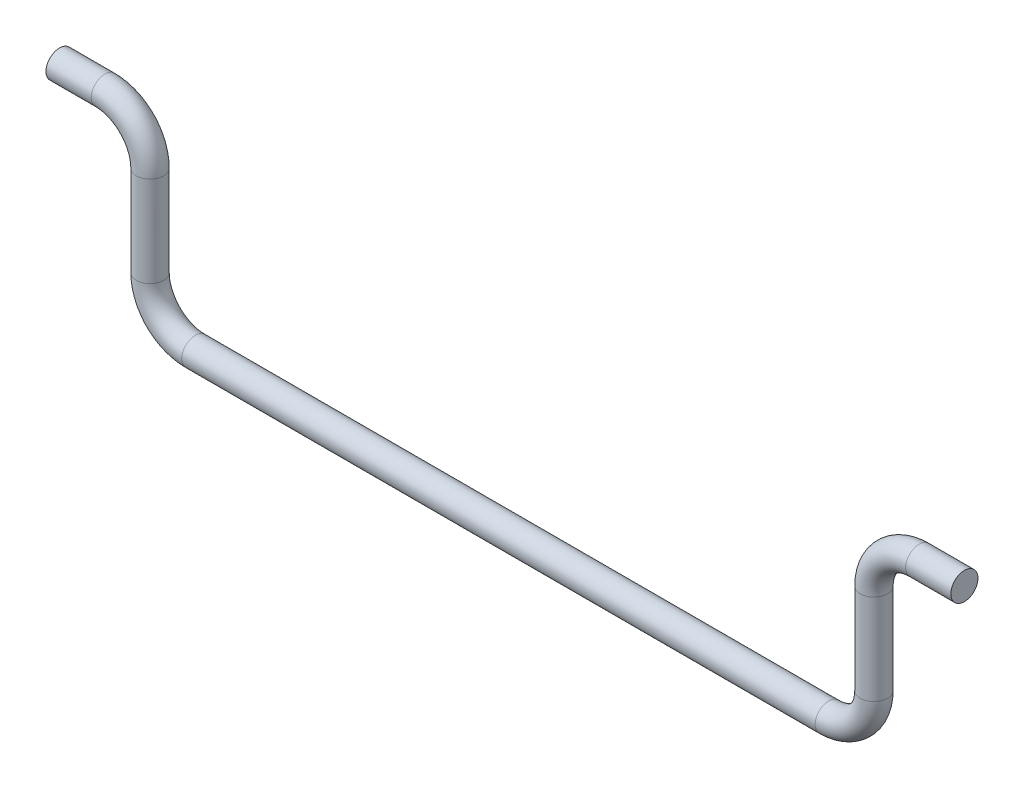
ISO-10303-21;
HEADER;
FILE_DESCRIPTION(('STEP AP214'),'2;1');
FILE_NAME('part.step','',(''),(''),'','','');
FILE_SCHEMA(('AUTOMOTIVE_DESIGN { 1 0 10303 214 1 1 1 1 }'));
ENDSEC;
DATA;
#1=APPLICATION_CONTEXT('core data for automotive mechanical design processes');
#2=APPLICATION_PROTOCOL_DEFINITION('international standard','automotive_design',2000,#1);
#3=PRODUCT_CONTEXT('',#1,'mechanical');
#4=PRODUCT('Part','Part','',(#3));
#5=PRODUCT_RELATED_PRODUCT_CATEGORY('part','',(#4));
#6=PRODUCT_DEFINITION_FORMATION('','',#4);
#7=PRODUCT_DEFINITION_CONTEXT('part definition',#1,'design');
#8=PRODUCT_DEFINITION('design','',#6,#7);
#9=PRODUCT_DEFINITION_SHAPE('','',#8);
#10=(LENGTH_UNIT() NAMED_UNIT(*) SI_UNIT(.MILLI.,.METRE.));
#11=(NAMED_UNIT(*) PLANE_ANGLE_UNIT() SI_UNIT($,.RADIAN.));
#12=(NAMED_UNIT(*) SI_UNIT($,.STERADIAN.) SOLID_ANGLE_UNIT());
#13=UNCERTAINTY_MEASURE_WITH_UNIT(LENGTH_MEASURE(1.E-05),#10,'distance_accuracy_value','');
#14=(GEOMETRIC_REPRESENTATION_CONTEXT(3) GLOBAL_UNCERTAINTY_ASSIGNED_CONTEXT((#13)) GLOBAL_UNIT_ASSIGNED_CONTEXT((#10,
#11,#12)) REPRESENTATION_CONTEXT('',''));
#15=CARTESIAN_POINT('',(0.,0.,0.));
#16=DIRECTION('',(0.,0.,1.));
#17=DIRECTION('',(1.,0.,0.));
#18=AXIS2_PLACEMENT_3D('',#15,#16,#17);
#19=CARTESIAN_POINT('',(0.,0.,0.));
#20=DIRECTION('',(1.,0.,0.));
#21=DIRECTION('',(0.,0.,-1.));
#22=AXIS2_PLACEMENT_3D('',#19,#20,#21);
#23=PLANE('',#22);
#24=CARTESIAN_POINT('',(0.,0.,0.));
#25=DIRECTION('',(1.,0.,0.));
#26=DIRECTION('',(0.,0.,-1.));
#27=AXIS2_PLACEMENT_3D('',#24,#25,#26);
#28=CIRCLE('',#27,0.6);
#29=CARTESIAN_POINT('',(0.,0.,-0.6));
#30=VERTEX_POINT('',#29);
#31=EDGE_CURVE('E65',#30,#30,#28,.T.);
#32=ORIENTED_EDGE('',*,*,#31,.F.);
#33=EDGE_LOOP('',(#32));
#34=FACE_BOUND('',#33,.T.);
#35=ADVANCED_FACE('F31',(#34),#23,.F.);
#36=CARTESIAN_POINT('',(40.,0.,0.));
#37=DIRECTION('',(1.,0.,0.));
#38=DIRECTION('',(0.,0.,-1.));
#39=AXIS2_PLACEMENT_3D('',#36,#37,#38);
#40=PLANE('',#39);
#41=CARTESIAN_POINT('',(40.,0.,0.));
#42=DIRECTION('',(1.,0.,0.));
#43=DIRECTION('',(0.,0.,-1.));
#44=AXIS2_PLACEMENT_3D('',#41,#42,#43);
#45=CIRCLE('',#44,0.6);
#46=CARTESIAN_POINT('',(40.,0.,-0.6));
#47=VERTEX_POINT('',#46);
#48=EDGE_CURVE('E10',#47,#47,#45,.T.);
#49=ORIENTED_EDGE('',*,*,#48,.T.);
#50=EDGE_LOOP('',(#49));
#51=FACE_BOUND('',#50,.T.);
#52=ADVANCED_FACE('F72',(#51),#40,.T.);
#53=CARTESIAN_POINT('',(0.,0.,0.));
#54=DIRECTION('',(1.,0.,0.));
#55=DIRECTION('',(0.,0.,-1.));
#56=AXIS2_PLACEMENT_3D('',#53,#54,#55);
#57=CYLINDRICAL_SURFACE('',#56,0.6);
#58=CARTESIAN_POINT('',(1.99999999999999,0.,0.));
#59=DIRECTION('',(1.,0.,0.));
#60=DIRECTION('',(0.,0.,-1.));
#61=AXIS2_PLACEMENT_3D('',#58,#59,#60);
#62=CIRCLE('',#61,0.6);
#63=CARTESIAN_POINT('',(1.99999999999998,0.6,0.));
#64=VERTEX_POINT('',#63);
#65=EDGE_CURVE('E62',#64,#64,#62,.T.);
#66=ORIENTED_EDGE('',*,*,#65,.F.);
#67=EDGE_LOOP('',(#66));
#68=FACE_BOUND('',#67,.T.);
#69=ORIENTED_EDGE('',*,*,#31,.T.);
#70=EDGE_LOOP('',(#69));
#71=FACE_BOUND('',#70,.T.);
#72=ADVANCED_FACE('F69',(#68,#71),#57,.T.);
#73=CARTESIAN_POINT('',(2.,-2.,0.));
#74=DIRECTION('',(0.,0.,-1.));
#75=DIRECTION('',(-1.,0.,0.));
#76=AXIS2_PLACEMENT_3D('',#73,#74,#75);
#77=TOROIDAL_SURFACE('',#76,2.,0.6);
#78=CARTESIAN_POINT('',(4.,-2.00000000000001,0.));
#79=DIRECTION('',(0.,-1.,0.));
#80=DIRECTION('',(0.,0.,-1.));
#81=AXIS2_PLACEMENT_3D('',#78,#79,#80);
#82=CIRCLE('',#81,0.6);
#83=CARTESIAN_POINT('',(4.6,-2.00000000000002,0.));
#84=VERTEX_POINT('',#83);
#85=EDGE_CURVE('E59',#84,#84,#82,.T.);
#86=CARTESIAN_POINT('',(2.,-2.,0.));
#87=DIRECTION('',(0.,0.,-1.));
#88=DIRECTION('',(-1.,0.,0.));
#89=AXIS2_PLACEMENT_3D('',#86,#87,#88);
#90=CIRCLE('',#89,2.6);
#91=EDGE_CURVE('',#64,#84,#90,.T.);
#92=ORIENTED_EDGE('',*,*,#65,.T.);
#93=ORIENTED_EDGE('',*,*,#85,.F.);
#94=ORIENTED_EDGE('',*,*,#91,.T.);
#95=ORIENTED_EDGE('',*,*,#91,.F.);
#96=EDGE_LOOP('',(#92,#94,#93,#95));
#97=FACE_BOUND('',#96,.T.);
#98=ADVANCED_FACE('F106',(#97),#77,.T.);
#99=CARTESIAN_POINT('',(4.,-2.00000000000001,0.));
#100=DIRECTION('',(0.,-1.,0.));
#101=DIRECTION('',(0.,0.,-1.));
#102=AXIS2_PLACEMENT_3D('',#99,#100,#101);
#103=CYLINDRICAL_SURFACE('',#102,0.6);
#104=CARTESIAN_POINT('',(4.,-5.99999999999999,0.));
#105=DIRECTION('',(0.,-1.,0.));
#106=DIRECTION('',(0.,0.,-1.));
#107=AXIS2_PLACEMENT_3D('',#104,#105,#106);
#108=CIRCLE('',#107,0.6);
#109=CARTESIAN_POINT('',(3.4,-5.99999999999998,0.));
#110=VERTEX_POINT('',#109);
#111=EDGE_CURVE('E56',#110,#110,#108,.T.);
#112=ORIENTED_EDGE('',*,*,#111,.F.);
#113=EDGE_LOOP('',(#112));
#114=FACE_BOUND('',#113,.T.);
#115=ORIENTED_EDGE('',*,*,#85,.T.);
#116=EDGE_LOOP('',(#115));
#117=FACE_BOUND('',#116,.T.);
#118=ADVANCED_FACE('F102',(#114,#117),#103,.T.);
#119=CARTESIAN_POINT('',(6.,-6.,0.));
#120=DIRECTION('',(0.,0.,1.));
#121=DIRECTION('',(1.,0.,0.));
#122=AXIS2_PLACEMENT_3D('',#119,#120,#121);
#123=TOROIDAL_SURFACE('',#122,2.,0.6);
#124=CARTESIAN_POINT('',(6.00000000000001,-8.,0.));
#125=DIRECTION('',(1.,0.,0.));
#126=DIRECTION('',(0.,0.,-1.));
#127=AXIS2_PLACEMENT_3D('',#124,#125,#126);
#128=CIRCLE('',#127,0.6);
#129=CARTESIAN_POINT('',(6.00000000000002,-8.6,0.));
#130=VERTEX_POINT('',#129);
#131=EDGE_CURVE('E53',#130,#130,#128,.T.);
#132=CARTESIAN_POINT('',(6.,-6.,0.));
#133=DIRECTION('',(0.,0.,1.));
#134=DIRECTION('',(1.,0.,0.));
#135=AXIS2_PLACEMENT_3D('',#132,#133,#134);
#136=CIRCLE('',#135,2.6);
#137=EDGE_CURVE('',#110,#130,#136,.T.);
#138=ORIENTED_EDGE('',*,*,#111,.T.);
#139=ORIENTED_EDGE('',*,*,#131,.F.);
#140=ORIENTED_EDGE('',*,*,#137,.T.);
#141=ORIENTED_EDGE('',*,*,#137,.F.);
#142=EDGE_LOOP('',(#138,#140,#139,#141));
#143=FACE_BOUND('',#142,.T.);
#144=ADVANCED_FACE('F98',(#143),#123,.T.);
#145=CARTESIAN_POINT('',(6.00000000000001,-8.,0.));
#146=DIRECTION('',(1.,0.,0.));
#147=DIRECTION('',(0.,1.,0.));
#148=AXIS2_PLACEMENT_3D('',#145,#146,#147);
#149=CYLINDRICAL_SURFACE('',#148,0.6);
#150=CARTESIAN_POINT('',(34.,-8.,0.));
#151=DIRECTION('',(1.,0.,0.));
#152=DIRECTION('',(0.,0.,-1.));
#153=AXIS2_PLACEMENT_3D('',#150,#151,#152);
#154=CIRCLE('',#153,0.6);
#155=CARTESIAN_POINT('',(34.,-8.6,0.));
#156=VERTEX_POINT('',#155);
#157=EDGE_CURVE('E50',#156,#156,#154,.T.);
#158=ORIENTED_EDGE('',*,*,#157,.F.);
#159=EDGE_LOOP('',(#158));
#160=FACE_BOUND('',#159,.T.);
#161=ORIENTED_EDGE('',*,*,#131,.T.);
#162=EDGE_LOOP('',(#161));
#163=FACE_BOUND('',#162,.T.);
#164=ADVANCED_FACE('F94',(#160,#163),#149,.T.);
#165=CARTESIAN_POINT('',(34.,-6.,0.));
#166=DIRECTION('',(0.,0.,1.));
#167=DIRECTION('',(1.,0.,0.));
#168=AXIS2_PLACEMENT_3D('',#165,#166,#167);
#169=TOROIDAL_SURFACE('',#168,2.,0.6);
#170=CARTESIAN_POINT('',(36.,-6.,0.));
#171=DIRECTION('',(0.,1.,0.));
#172=DIRECTION('',(0.,0.,-1.));
#173=AXIS2_PLACEMENT_3D('',#170,#171,#172);
#174=CIRCLE('',#173,0.6);
#175=CARTESIAN_POINT('',(36.6,-6.,0.));
#176=VERTEX_POINT('',#175);
#177=EDGE_CURVE('E45',#176,#176,#174,.T.);
#178=CARTESIAN_POINT('',(34.,-6.,0.));
#179=DIRECTION('',(0.,0.,1.));
#180=DIRECTION('',(1.,0.,0.));
#181=AXIS2_PLACEMENT_3D('',#178,#179,#180);
#182=CIRCLE('',#181,2.6);
#183=EDGE_CURVE('',#156,#176,#182,.T.);
#184=ORIENTED_EDGE('',*,*,#157,.T.);
#185=ORIENTED_EDGE('',*,*,#177,.F.);
#186=ORIENTED_EDGE('',*,*,#183,.T.);
#187=ORIENTED_EDGE('',*,*,#183,.F.);
#188=EDGE_LOOP('',(#184,#186,#185,#187));
#189=FACE_BOUND('',#188,.T.);
#190=ADVANCED_FACE('F90',(#189),#169,.T.);
#191=CARTESIAN_POINT('',(36.,-6.,0.));
#192=DIRECTION('',(0.,1.,0.));
#193=DIRECTION('',(0.,0.,1.));
#194=AXIS2_PLACEMENT_3D('',#191,#192,#193);
#195=CYLINDRICAL_SURFACE('',#194,0.6);
#196=CARTESIAN_POINT('',(36.,-2.00000000000001,0.));
#197=DIRECTION('',(0.,1.,0.));
#198=DIRECTION('',(0.,0.,-1.));
#199=AXIS2_PLACEMENT_3D('',#196,#197,#198);
#200=CIRCLE('',#199,0.6);
#201=CARTESIAN_POINT('',(35.4,-2.00000000000002,0.));
#202=VERTEX_POINT('',#201);
#203=EDGE_CURVE('E41',#202,#202,#200,.T.);
#204=ORIENTED_EDGE('',*,*,#203,.F.);
#205=EDGE_LOOP('',(#204));
#206=FACE_BOUND('',#205,.T.);
#207=ORIENTED_EDGE('',*,*,#177,.T.);
#208=EDGE_LOOP('',(#207));
#209=FACE_BOUND('',#208,.T.);
#210=ADVANCED_FACE('F84',(#206,#209),#195,.T.);
#211=CARTESIAN_POINT('',(38.,-2.,0.));
#212=DIRECTION('',(0.,0.,-1.));
#213=DIRECTION('',(-1.,0.,0.));
#214=AXIS2_PLACEMENT_3D('',#211,#212,#213);
#215=TOROIDAL_SURFACE('',#214,2.,0.6);
#216=CARTESIAN_POINT('',(38.,0.,0.));
#217=DIRECTION('',(1.,0.,0.));
#218=DIRECTION('',(0.,0.,-1.));
#219=AXIS2_PLACEMENT_3D('',#216,#217,#218);
#220=CIRCLE('',#219,0.6);
#221=CARTESIAN_POINT('',(38.,0.600000000000002,0.));
#222=VERTEX_POINT('',#221);
#223=EDGE_CURVE('E37',#222,#222,#220,.T.);
#224=CARTESIAN_POINT('',(38.,-2.,0.));
#225=DIRECTION('',(0.,0.,-1.));
#226=DIRECTION('',(-1.,0.,0.));
#227=AXIS2_PLACEMENT_3D('',#224,#225,#226);
#228=CIRCLE('',#227,2.6);
#229=EDGE_CURVE('',#202,#222,#228,.T.);
#230=ORIENTED_EDGE('',*,*,#203,.T.);
#231=ORIENTED_EDGE('',*,*,#223,.F.);
#232=ORIENTED_EDGE('',*,*,#229,.T.);
#233=ORIENTED_EDGE('',*,*,#229,.F.);
#234=EDGE_LOOP('',(#230,#232,#231,#233));
#235=FACE_BOUND('',#234,.T.);
#236=ADVANCED_FACE('F78',(#235),#215,.T.);
#237=CARTESIAN_POINT('',(38.,0.,0.));
#238=DIRECTION('',(1.,0.,0.));
#239=DIRECTION('',(0.,0.,-1.));
#240=AXIS2_PLACEMENT_3D('',#237,#238,#239);
#241=CYLINDRICAL_SURFACE('',#240,0.6);
#242=ORIENTED_EDGE('',*,*,#48,.F.);
#243=EDGE_LOOP('',(#242));
#244=FACE_BOUND('',#243,.T.);
#245=ORIENTED_EDGE('',*,*,#223,.T.);
#246=EDGE_LOOP('',(#245));
#247=FACE_BOUND('',#246,.T.);
#248=ADVANCED_FACE('F76',(#244,#247),#241,.T.);
#249=CLOSED_SHELL('',(#35,#52,#72,#98,#118,#144,#164,#190,#210,#236,#248));
#250=MANIFOLD_SOLID_BREP('B2',#249);
#251=ADVANCED_BREP_SHAPE_REPRESENTATION('',(#18,#250),#14);
#252=SHAPE_DEFINITION_REPRESENTATION(#9,#251);
ENDSEC;
END-ISO-10303-21;
